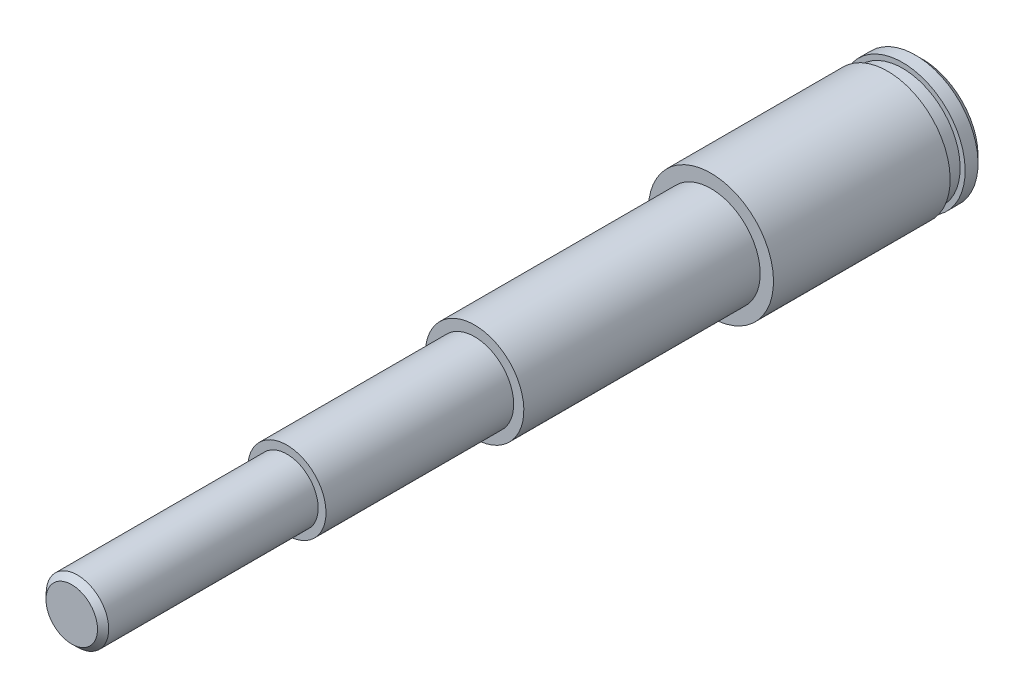
ISO-10303-21;
HEADER;
FILE_DESCRIPTION(('STEP AP214'),'2;1');
FILE_NAME('part.step','',(''),(''),'','','');
FILE_SCHEMA(('AUTOMOTIVE_DESIGN { 1 0 10303 214 1 1 1 1 }'));
ENDSEC;
DATA;
#1=APPLICATION_CONTEXT('core data for automotive mechanical design processes');
#2=APPLICATION_PROTOCOL_DEFINITION('international standard','automotive_design',2000,#1);
#3=PRODUCT_CONTEXT('',#1,'mechanical');
#4=PRODUCT('Part','Part','',(#3));
#5=PRODUCT_RELATED_PRODUCT_CATEGORY('part','',(#4));
#6=PRODUCT_DEFINITION_FORMATION('','',#4);
#7=PRODUCT_DEFINITION_CONTEXT('part definition',#1,'design');
#8=PRODUCT_DEFINITION('design','',#6,#7);
#9=PRODUCT_DEFINITION_SHAPE('','',#8);
#10=(LENGTH_UNIT() NAMED_UNIT(*) SI_UNIT(.MILLI.,.METRE.));
#11=(NAMED_UNIT(*) PLANE_ANGLE_UNIT() SI_UNIT($,.RADIAN.));
#12=(NAMED_UNIT(*) SI_UNIT($,.STERADIAN.) SOLID_ANGLE_UNIT());
#13=UNCERTAINTY_MEASURE_WITH_UNIT(LENGTH_MEASURE(1.E-05),#10,'distance_accuracy_value','');
#14=(GEOMETRIC_REPRESENTATION_CONTEXT(3) GLOBAL_UNCERTAINTY_ASSIGNED_CONTEXT((#13)) GLOBAL_UNIT_ASSIGNED_CONTEXT((#10,
#11,#12)) REPRESENTATION_CONTEXT('',''));
#15=CARTESIAN_POINT('',(0.,0.,0.));
#16=DIRECTION('',(0.,0.,1.));
#17=DIRECTION('',(1.,0.,0.));
#18=AXIS2_PLACEMENT_3D('',#15,#16,#17);
#19=CARTESIAN_POINT('',(0.,0.363804758208036,19.8067704128135));
#20=DIRECTION('',(0.,0.,-1.));
#21=DIRECTION('',(0.,1.,0.));
#22=AXIS2_PLACEMENT_3D('',#19,#20,#21);
#23=PLANE('',#22);
#24=CARTESIAN_POINT('',(0.,0.363804758208036,19.8067704128135));
#25=DIRECTION('',(0.,0.,1.));
#26=DIRECTION('',(0.,-1.,0.));
#27=AXIS2_PLACEMENT_3D('',#24,#25,#26);
#28=CIRCLE('',#27,1.30799382820672);
#29=CARTESIAN_POINT('',(0.,-0.944189069998681,19.8067704128135));
#30=VERTEX_POINT('',#29);
#31=EDGE_CURVE('E10',#30,#30,#28,.T.);
#32=ORIENTED_EDGE('',*,*,#31,.T.);
#33=EDGE_LOOP('',(#32));
#34=FACE_BOUND('',#33,.T.);
#35=ADVANCED_FACE('F30',(#34),#23,.F.);
#36=CARTESIAN_POINT('',(0.,0.363804758208036,19.5171006220107));
#37=DIRECTION('',(0.,0.,-1.));
#38=DIRECTION('',(0.,1.,0.));
#39=AXIS2_PLACEMENT_3D('',#36,#37,#38);
#40=CONICAL_SURFACE('',#39,1.5875,0.76754333533404);
#41=ORIENTED_EDGE('',*,*,#31,.F.);
#42=EDGE_LOOP('',(#41));
#43=FACE_BOUND('',#42,.T.);
#44=CARTESIAN_POINT('',(0.,0.363804758208036,19.5171006220107));
#45=DIRECTION('',(0.,0.,1.));
#46=DIRECTION('',(0.,-1.,0.));
#47=AXIS2_PLACEMENT_3D('',#44,#45,#46);
#48=CIRCLE('',#47,1.5875);
#49=CARTESIAN_POINT('',(0.,-1.22369524179197,19.5171006220107));
#50=VERTEX_POINT('',#49);
#51=EDGE_CURVE('E36',#50,#50,#48,.T.);
#52=ORIENTED_EDGE('',*,*,#51,.T.);
#53=EDGE_LOOP('',(#52));
#54=FACE_BOUND('',#53,.T.);
#55=ADVANCED_FACE('F92',(#43,#54),#40,.T.);
#56=CARTESIAN_POINT('',(0.,0.363804758208036,19.8067704128135));
#57=DIRECTION('',(0.,0.,1.));
#58=DIRECTION('',(0.,-1.,0.));
#59=AXIS2_PLACEMENT_3D('',#56,#57,#58);
#60=CYLINDRICAL_SURFACE('',#59,1.5875);
#61=ORIENTED_EDGE('',*,*,#51,.F.);
#62=EDGE_LOOP('',(#61));
#63=FACE_BOUND('',#62,.T.);
#64=CARTESIAN_POINT('',(0.,0.363804758208037,8.88332485599562));
#65=DIRECTION('',(0.,0.,1.));
#66=DIRECTION('',(0.,-1.,0.));
#67=AXIS2_PLACEMENT_3D('',#64,#65,#66);
#68=CIRCLE('',#67,1.5875);
#69=CARTESIAN_POINT('',(0.,-1.22369524179197,8.88332485599562));
#70=VERTEX_POINT('',#69);
#71=EDGE_CURVE('E40',#70,#70,#68,.T.);
#72=ORIENTED_EDGE('',*,*,#71,.T.);
#73=EDGE_LOOP('',(#72));
#74=FACE_BOUND('',#73,.T.);
#75=ADVANCED_FACE('F96',(#63,#74),#60,.T.);
#76=CARTESIAN_POINT('',(0.,1.95130475820804,8.88332485599562));
#77=DIRECTION('',(0.,0.,-1.));
#78=DIRECTION('',(0.,1.,0.));
#79=AXIS2_PLACEMENT_3D('',#76,#77,#78);
#80=PLANE('',#79);
#81=ORIENTED_EDGE('',*,*,#71,.F.);
#82=EDGE_LOOP('',(#81));
#83=FACE_BOUND('',#82,.T.);
#84=CARTESIAN_POINT('',(0.,0.363804758208037,8.88332485599562));
#85=DIRECTION('',(0.,0.,1.));
#86=DIRECTION('',(0.,-1.,0.));
#87=AXIS2_PLACEMENT_3D('',#84,#85,#86);
#88=CIRCLE('',#87,1.98437499999975);
#89=CARTESIAN_POINT('',(0.,-1.62057024179171,8.88332485599562));
#90=VERTEX_POINT('',#89);
#91=EDGE_CURVE('E44',#90,#90,#88,.T.);
#92=ORIENTED_EDGE('',*,*,#91,.T.);
#93=EDGE_LOOP('',(#92));
#94=FACE_BOUND('',#93,.T.);
#95=ADVANCED_FACE('F101',(#83,#94),#80,.F.);
#96=CARTESIAN_POINT('',(0.,0.363804758208036,19.8067704128135));
#97=DIRECTION('',(0.,0.,1.));
#98=DIRECTION('',(0.,-1.,0.));
#99=AXIS2_PLACEMENT_3D('',#96,#97,#98);
#100=CYLINDRICAL_SURFACE('',#99,1.98437499999975);
#101=ORIENTED_EDGE('',*,*,#91,.F.);
#102=EDGE_LOOP('',(#101));
#103=FACE_BOUND('',#102,.T.);
#104=CARTESIAN_POINT('',(0.,0.363804758208038,-0.645515011623191));
#105=DIRECTION('',(0.,0.,1.));
#106=DIRECTION('',(0.,-1.,0.));
#107=AXIS2_PLACEMENT_3D('',#104,#105,#106);
#108=CIRCLE('',#107,1.98437499999975);
#109=CARTESIAN_POINT('',(0.,-1.62057024179171,-0.645515011623191));
#110=VERTEX_POINT('',#109);
#111=EDGE_CURVE('E49',#110,#110,#108,.T.);
#112=ORIENTED_EDGE('',*,*,#111,.T.);
#113=EDGE_LOOP('',(#112));
#114=FACE_BOUND('',#113,.T.);
#115=ADVANCED_FACE('F107',(#103,#114),#100,.T.);
#116=CARTESIAN_POINT('',(0.,2.34817975820779,-0.645515011623193));
#117=DIRECTION('',(0.,0.,-1.));
#118=DIRECTION('',(0.,1.,0.));
#119=AXIS2_PLACEMENT_3D('',#116,#117,#118);
#120=PLANE('',#119);
#121=ORIENTED_EDGE('',*,*,#111,.F.);
#122=EDGE_LOOP('',(#121));
#123=FACE_BOUND('',#122,.T.);
#124=CARTESIAN_POINT('',(0.,0.363804758208038,-0.645515011623191));
#125=DIRECTION('',(0.,0.,1.));
#126=DIRECTION('',(0.,-1.,0.));
#127=AXIS2_PLACEMENT_3D('',#124,#125,#126);
#128=CIRCLE('',#127,2.5);
#129=CARTESIAN_POINT('',(0.,-2.13619524179196,-0.645515011623192));
#130=VERTEX_POINT('',#129);
#131=EDGE_CURVE('E52',#130,#130,#128,.T.);
#132=ORIENTED_EDGE('',*,*,#131,.T.);
#133=EDGE_LOOP('',(#132));
#134=FACE_BOUND('',#133,.T.);
#135=ADVANCED_FACE('F111',(#123,#134),#120,.F.);
#136=CARTESIAN_POINT('',(0.,0.363804758208036,19.8067704128135));
#137=DIRECTION('',(0.,0.,1.));
#138=DIRECTION('',(0.,-1.,0.));
#139=AXIS2_PLACEMENT_3D('',#136,#137,#138);
#140=CYLINDRICAL_SURFACE('',#139,2.5);
#141=ORIENTED_EDGE('',*,*,#131,.F.);
#142=EDGE_LOOP('',(#141));
#143=FACE_BOUND('',#142,.T.);
#144=CARTESIAN_POINT('',(0.,0.363804758208039,-12.6455654059886));
#145=DIRECTION('',(0.,0.,1.));
#146=DIRECTION('',(0.,-1.,0.));
#147=AXIS2_PLACEMENT_3D('',#144,#145,#146);
#148=CIRCLE('',#147,2.5);
#149=CARTESIAN_POINT('',(0.,-2.13619524179196,-12.6455654059886));
#150=VERTEX_POINT('',#149);
#151=EDGE_CURVE('E55',#150,#150,#148,.T.);
#152=ORIENTED_EDGE('',*,*,#151,.T.);
#153=EDGE_LOOP('',(#152));
#154=FACE_BOUND('',#153,.T.);
#155=ADVANCED_FACE('F115',(#143,#154),#140,.T.);
#156=CARTESIAN_POINT('',(0.,2.86380475820804,-12.6455654059886));
#157=DIRECTION('',(0.,0.,-1.));
#158=DIRECTION('',(0.,1.,0.));
#159=AXIS2_PLACEMENT_3D('',#156,#157,#158);
#160=PLANE('',#159);
#161=ORIENTED_EDGE('',*,*,#151,.F.);
#162=EDGE_LOOP('',(#161));
#163=FACE_BOUND('',#162,.T.);
#164=CARTESIAN_POINT('',(0.,0.363804758208039,-12.6455654059886));
#165=DIRECTION('',(0.,0.,1.));
#166=DIRECTION('',(0.,-1.,0.));
#167=AXIS2_PLACEMENT_3D('',#164,#165,#166);
#168=CIRCLE('',#167,3.175);
#169=CARTESIAN_POINT('',(0.,-2.81119524179196,-12.6455654059886));
#170=VERTEX_POINT('',#169);
#171=EDGE_CURVE('E58',#170,#170,#168,.T.);
#172=ORIENTED_EDGE('',*,*,#171,.T.);
#173=EDGE_LOOP('',(#172));
#174=FACE_BOUND('',#173,.T.);
#175=ADVANCED_FACE('F119',(#163,#174),#160,.F.);
#176=CARTESIAN_POINT('',(0.,0.363804758208036,19.8067704128135));
#177=DIRECTION('',(0.,0.,1.));
#178=DIRECTION('',(0.,-1.,0.));
#179=AXIS2_PLACEMENT_3D('',#176,#177,#178);
#180=CYLINDRICAL_SURFACE('',#179,3.175);
#181=ORIENTED_EDGE('',*,*,#171,.F.);
#182=EDGE_LOOP('',(#181));
#183=FACE_BOUND('',#182,.T.);
#184=CARTESIAN_POINT('',(0.,0.363804758208041,-21.6149999162531));
#185=DIRECTION('',(0.,0.,1.));
#186=DIRECTION('',(0.,-1.,0.));
#187=AXIS2_PLACEMENT_3D('',#184,#185,#186);
#188=CIRCLE('',#187,3.175);
#189=CARTESIAN_POINT('',(0.,-2.81119524179196,-21.6149999162531));
#190=VERTEX_POINT('',#189);
#191=EDGE_CURVE('E61',#190,#190,#188,.T.);
#192=ORIENTED_EDGE('',*,*,#191,.T.);
#193=EDGE_LOOP('',(#192));
#194=FACE_BOUND('',#193,.T.);
#195=ADVANCED_FACE('F123',(#183,#194),#180,.T.);
#196=CARTESIAN_POINT('',(0.,3.53880475820804,-21.6149999162531));
#197=DIRECTION('',(0.,0.,1.));
#198=DIRECTION('',(0.,-1.,0.));
#199=AXIS2_PLACEMENT_3D('',#196,#197,#198);
#200=PLANE('',#199);
#201=ORIENTED_EDGE('',*,*,#191,.F.);
#202=EDGE_LOOP('',(#201));
#203=FACE_BOUND('',#202,.T.);
#204=CARTESIAN_POINT('',(0.,0.363804758208041,-21.6149999162531));
#205=DIRECTION('',(0.,0.,1.));
#206=DIRECTION('',(0.,-1.,0.));
#207=AXIS2_PLACEMENT_3D('',#204,#205,#206);
#208=CIRCLE('',#207,2.921);
#209=CARTESIAN_POINT('',(0.,-2.55719524179196,-21.6149999162531));
#210=VERTEX_POINT('',#209);
#211=EDGE_CURVE('E64',#210,#210,#208,.T.);
#212=ORIENTED_EDGE('',*,*,#211,.T.);
#213=EDGE_LOOP('',(#212));
#214=FACE_BOUND('',#213,.T.);
#215=ADVANCED_FACE('F127',(#203,#214),#200,.F.);
#216=CARTESIAN_POINT('',(0.,0.363804758208036,19.8067704128135));
#217=DIRECTION('',(0.,0.,1.));
#218=DIRECTION('',(0.,-1.,0.));
#219=AXIS2_PLACEMENT_3D('',#216,#217,#218);
#220=CYLINDRICAL_SURFACE('',#219,2.921);
#221=ORIENTED_EDGE('',*,*,#211,.F.);
#222=EDGE_LOOP('',(#221));
#223=FACE_BOUND('',#222,.T.);
#224=CARTESIAN_POINT('',(0.,0.363804758208041,-22.3769999162531));
#225=DIRECTION('',(0.,0.,1.));
#226=DIRECTION('',(0.,-1.,0.));
#227=AXIS2_PLACEMENT_3D('',#224,#225,#226);
#228=CIRCLE('',#227,2.921);
#229=CARTESIAN_POINT('',(0.,-2.55719524179196,-22.3769999162531));
#230=VERTEX_POINT('',#229);
#231=EDGE_CURVE('E67',#230,#230,#228,.T.);
#232=ORIENTED_EDGE('',*,*,#231,.T.);
#233=EDGE_LOOP('',(#232));
#234=FACE_BOUND('',#233,.T.);
#235=ADVANCED_FACE('F131',(#223,#234),#220,.T.);
#236=CARTESIAN_POINT('',(0.,3.53880475820804,-22.3769999162531));
#237=DIRECTION('',(0.,0.,-1.));
#238=DIRECTION('',(0.,1.,0.));
#239=AXIS2_PLACEMENT_3D('',#236,#237,#238);
#240=PLANE('',#239);
#241=ORIENTED_EDGE('',*,*,#231,.F.);
#242=EDGE_LOOP('',(#241));
#243=FACE_BOUND('',#242,.T.);
#244=CARTESIAN_POINT('',(0.,0.363804758208041,-22.3769999162531));
#245=DIRECTION('',(0.,0.,1.));
#246=DIRECTION('',(0.,-1.,0.));
#247=AXIS2_PLACEMENT_3D('',#244,#245,#246);
#248=CIRCLE('',#247,3.175);
#249=CARTESIAN_POINT('',(0.,-2.81119524179196,-22.3769999162531));
#250=VERTEX_POINT('',#249);
#251=EDGE_CURVE('E70',#250,#250,#248,.T.);
#252=ORIENTED_EDGE('',*,*,#251,.T.);
#253=EDGE_LOOP('',(#252));
#254=FACE_BOUND('',#253,.T.);
#255=ADVANCED_FACE('F135',(#243,#254),#240,.F.);
#256=CARTESIAN_POINT('',(0.,0.363804758208036,19.8067704128135));
#257=DIRECTION('',(0.,0.,1.));
#258=DIRECTION('',(0.,-1.,0.));
#259=AXIS2_PLACEMENT_3D('',#256,#257,#258);
#260=CYLINDRICAL_SURFACE('',#259,3.175);
#261=ORIENTED_EDGE('',*,*,#251,.F.);
#262=EDGE_LOOP('',(#261));
#263=FACE_BOUND('',#262,.T.);
#264=CARTESIAN_POINT('',(0.,0.363804758208041,-23.0302830595851));
#265=DIRECTION('',(0.,0.,1.));
#266=DIRECTION('',(0.,-1.,0.));
#267=AXIS2_PLACEMENT_3D('',#264,#265,#266);
#268=CIRCLE('',#267,3.175);
#269=CARTESIAN_POINT('',(0.,-2.81119524179196,-23.0302830595851));
#270=VERTEX_POINT('',#269);
#271=EDGE_CURVE('E73',#270,#270,#268,.T.);
#272=ORIENTED_EDGE('',*,*,#271,.T.);
#273=EDGE_LOOP('',(#272));
#274=FACE_BOUND('',#273,.T.);
#275=ADVANCED_FACE('F88',(#263,#274),#260,.T.);
#276=CARTESIAN_POINT('',(0.,0.363804758208041,-23.3793314040557));
#277=DIRECTION('',(0.,0.,1.));
#278=DIRECTION('',(0.,-1.,0.));
#279=AXIS2_PLACEMENT_3D('',#276,#277,#278);
#280=CONICAL_SURFACE('',#279,2.82595165552937,0.785398163397446);
#281=ORIENTED_EDGE('',*,*,#271,.F.);
#282=EDGE_LOOP('',(#281));
#283=FACE_BOUND('',#282,.T.);
#284=CARTESIAN_POINT('',(0.,0.363804758208041,-23.3793314040557));
#285=DIRECTION('',(0.,0.,1.));
#286=DIRECTION('',(0.,-1.,0.));
#287=AXIS2_PLACEMENT_3D('',#284,#285,#286);
#288=CIRCLE('',#287,2.82595165552937);
#289=CARTESIAN_POINT('',(0.,-2.46214689732133,-23.3793314040557));
#290=VERTEX_POINT('',#289);
#291=EDGE_CURVE('E76',#290,#290,#288,.T.);
#292=ORIENTED_EDGE('',*,*,#291,.T.);
#293=EDGE_LOOP('',(#292));
#294=FACE_BOUND('',#293,.T.);
#295=ADVANCED_FACE('F80',(#283,#294),#280,.T.);
#296=CARTESIAN_POINT('',(0.,3.18975641373741,-23.3793314040557));
#297=DIRECTION('',(0.,0.,1.));
#298=DIRECTION('',(0.,-1.,0.));
#299=AXIS2_PLACEMENT_3D('',#296,#297,#298);
#300=PLANE('',#299);
#301=ORIENTED_EDGE('',*,*,#291,.F.);
#302=EDGE_LOOP('',(#301));
#303=FACE_BOUND('',#302,.T.);
#304=ADVANCED_FACE('F82',(#303),#300,.F.);
#305=CLOSED_SHELL('',(#35,#55,#75,#95,#115,#135,#155,#175,#195,#215,#235,#255,#275,#295,#304));
#306=MANIFOLD_SOLID_BREP('B2',#305);
#307=ADVANCED_BREP_SHAPE_REPRESENTATION('',(#18,#306),#14);
#308=SHAPE_DEFINITION_REPRESENTATION(#9,#307);
ENDSEC;
END-ISO-10303-21;
